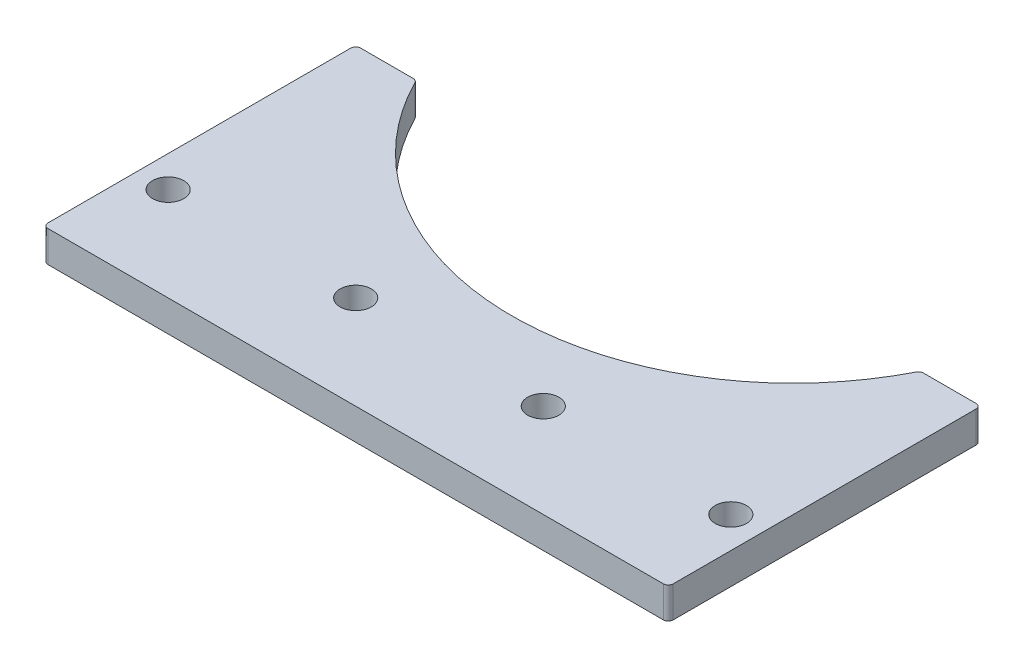
ISO-10303-21;
HEADER;
FILE_DESCRIPTION(('STEP AP214'),'2;1');
FILE_NAME('part.step','',(''),(''),'','','');
FILE_SCHEMA(('AUTOMOTIVE_DESIGN { 1 0 10303 214 1 1 1 1 }'));
ENDSEC;
DATA;
#1=APPLICATION_CONTEXT('core data for automotive mechanical design processes');
#2=APPLICATION_PROTOCOL_DEFINITION('international standard','automotive_design',2000,#1);
#3=PRODUCT_CONTEXT('',#1,'mechanical');
#4=PRODUCT('Part','Part','',(#3));
#5=PRODUCT_RELATED_PRODUCT_CATEGORY('part','',(#4));
#6=PRODUCT_DEFINITION_FORMATION('','',#4);
#7=PRODUCT_DEFINITION_CONTEXT('part definition',#1,'design');
#8=PRODUCT_DEFINITION('design','',#6,#7);
#9=PRODUCT_DEFINITION_SHAPE('','',#8);
#10=(LENGTH_UNIT() NAMED_UNIT(*) SI_UNIT(.MILLI.,.METRE.));
#11=(NAMED_UNIT(*) PLANE_ANGLE_UNIT() SI_UNIT($,.RADIAN.));
#12=(NAMED_UNIT(*) SI_UNIT($,.STERADIAN.) SOLID_ANGLE_UNIT());
#13=UNCERTAINTY_MEASURE_WITH_UNIT(LENGTH_MEASURE(1.E-05),#10,'distance_accuracy_value','');
#14=(GEOMETRIC_REPRESENTATION_CONTEXT(3) GLOBAL_UNCERTAINTY_ASSIGNED_CONTEXT((#13)) GLOBAL_UNIT_ASSIGNED_CONTEXT((#10,
#11,#12)) REPRESENTATION_CONTEXT('',''));
#15=CARTESIAN_POINT('',(0.,0.,0.));
#16=DIRECTION('',(0.,0.,1.));
#17=DIRECTION('',(1.,0.,0.));
#18=AXIS2_PLACEMENT_3D('',#15,#16,#17);
#19=CARTESIAN_POINT('',(-63.5,6.35,88.9));
#20=DIRECTION('',(1.,0.,0.));
#21=DIRECTION('',(0.,0.,-1.));
#22=AXIS2_PLACEMENT_3D('',#19,#20,#21);
#23=PLANE('',#22);
#24=DIRECTION('',(0.,0.,1.));
#25=VECTOR('',#24,1.);
#26=CARTESIAN_POINT('',(-63.5,6.35,88.9));
#27=LINE('',#26,#25);
#28=CARTESIAN_POINT('',(-63.5,6.35,26.4));
#29=VERTEX_POINT('',#28);
#30=CARTESIAN_POINT('',(-63.5,6.35,87.9));
#31=VERTEX_POINT('',#30);
#32=EDGE_CURVE('E148',#29,#31,#27,.T.);
#33=ORIENTED_EDGE('',*,*,#32,.F.);
#34=DIRECTION('',(0.,-1.,0.));
#35=VECTOR('',#34,1.);
#36=CARTESIAN_POINT('',(-63.5,6.35,26.4));
#37=LINE('',#36,#35);
#38=CARTESIAN_POINT('',(-63.5,0.,26.4));
#39=VERTEX_POINT('',#38);
#40=EDGE_CURVE('E183',#29,#39,#37,.T.);
#41=ORIENTED_EDGE('',*,*,#40,.T.);
#42=DIRECTION('',(0.,0.,1.));
#43=VECTOR('',#42,1.);
#44=CARTESIAN_POINT('',(-63.5,0.,88.9));
#45=LINE('',#44,#43);
#46=CARTESIAN_POINT('',(-63.5,0.,87.9));
#47=VERTEX_POINT('',#46);
#48=EDGE_CURVE('E209',#39,#47,#45,.T.);
#49=ORIENTED_EDGE('',*,*,#48,.T.);
#50=DIRECTION('',(0.,-1.,0.));
#51=VECTOR('',#50,1.);
#52=CARTESIAN_POINT('',(-63.5,6.35,87.9));
#53=LINE('',#52,#51);
#54=EDGE_CURVE('E181',#47,#31,#53,.F.);
#55=ORIENTED_EDGE('',*,*,#54,.T.);
#56=EDGE_LOOP('',(#33,#41,#49,#55));
#57=FACE_BOUND('',#56,.T.);
#58=ADVANCED_FACE('F33',(#57),#23,.F.);
#59=CARTESIAN_POINT('',(-63.5,6.35,88.9));
#60=DIRECTION('',(0.,0.,-1.));
#61=DIRECTION('',(-1.,0.,0.));
#62=AXIS2_PLACEMENT_3D('',#59,#60,#61);
#63=PLANE('',#62);
#64=DIRECTION('',(1.,0.,0.));
#65=VECTOR('',#64,1.);
#66=CARTESIAN_POINT('',(-63.5,6.35,88.9));
#67=LINE('',#66,#65);
#68=CARTESIAN_POINT('',(-62.5,6.35,88.9));
#69=VERTEX_POINT('',#68);
#70=CARTESIAN_POINT('',(62.5,6.35,88.9));
#71=VERTEX_POINT('',#70);
#72=EDGE_CURVE('E152',#69,#71,#67,.T.);
#73=ORIENTED_EDGE('',*,*,#72,.F.);
#74=DIRECTION('',(0.,-1.,0.));
#75=VECTOR('',#74,1.);
#76=CARTESIAN_POINT('',(-62.5,6.35,88.9));
#77=LINE('',#76,#75);
#78=CARTESIAN_POINT('',(-62.5,0.,88.9));
#79=VERTEX_POINT('',#78);
#80=EDGE_CURVE('E188',#69,#79,#77,.T.);
#81=ORIENTED_EDGE('',*,*,#80,.T.);
#82=DIRECTION('',(1.,0.,0.));
#83=VECTOR('',#82,1.);
#84=CARTESIAN_POINT('',(-63.5,0.,88.9));
#85=LINE('',#84,#83);
#86=CARTESIAN_POINT('',(62.5,0.,88.9));
#87=VERTEX_POINT('',#86);
#88=EDGE_CURVE('E204',#79,#87,#85,.T.);
#89=ORIENTED_EDGE('',*,*,#88,.T.);
#90=DIRECTION('',(0.,-1.,0.));
#91=VECTOR('',#90,1.);
#92=CARTESIAN_POINT('',(62.5,6.35,88.9));
#93=LINE('',#92,#91);
#94=EDGE_CURVE('E186',#87,#71,#93,.F.);
#95=ORIENTED_EDGE('',*,*,#94,.T.);
#96=EDGE_LOOP('',(#73,#81,#89,#95));
#97=FACE_BOUND('',#96,.T.);
#98=ADVANCED_FACE('F281',(#97),#63,.F.);
#99=CARTESIAN_POINT('',(63.5,6.35,88.9));
#100=DIRECTION('',(-1.,0.,0.));
#101=DIRECTION('',(0.,0.,1.));
#102=AXIS2_PLACEMENT_3D('',#99,#100,#101);
#103=PLANE('',#102);
#104=DIRECTION('',(0.,0.,-1.));
#105=VECTOR('',#104,1.);
#106=CARTESIAN_POINT('',(63.5,6.35,88.9));
#107=LINE('',#106,#105);
#108=CARTESIAN_POINT('',(63.5,6.35,87.9));
#109=VERTEX_POINT('',#108);
#110=CARTESIAN_POINT('',(63.5,6.35,26.4));
#111=VERTEX_POINT('',#110);
#112=EDGE_CURVE('E218',#109,#111,#107,.T.);
#113=ORIENTED_EDGE('',*,*,#112,.F.);
#114=DIRECTION('',(0.,-1.,0.));
#115=VECTOR('',#114,1.);
#116=CARTESIAN_POINT('',(63.5,6.35,87.9));
#117=LINE('',#116,#115);
#118=CARTESIAN_POINT('',(63.5,0.,87.9));
#119=VERTEX_POINT('',#118);
#120=EDGE_CURVE('E193',#109,#119,#117,.T.);
#121=ORIENTED_EDGE('',*,*,#120,.T.);
#122=DIRECTION('',(0.,0.,-1.));
#123=VECTOR('',#122,1.);
#124=CARTESIAN_POINT('',(63.5,0.,88.9));
#125=LINE('',#124,#123);
#126=CARTESIAN_POINT('',(63.5,0.,26.4));
#127=VERTEX_POINT('',#126);
#128=EDGE_CURVE('E203',#119,#127,#125,.T.);
#129=ORIENTED_EDGE('',*,*,#128,.T.);
#130=DIRECTION('',(0.,-1.,0.));
#131=VECTOR('',#130,1.);
#132=CARTESIAN_POINT('',(63.5,6.35,26.4));
#133=LINE('',#132,#131);
#134=EDGE_CURVE('E191',#127,#111,#133,.F.);
#135=ORIENTED_EDGE('',*,*,#134,.T.);
#136=EDGE_LOOP('',(#113,#121,#129,#135));
#137=FACE_BOUND('',#136,.T.);
#138=ADVANCED_FACE('F287',(#137),#103,.F.);
#139=CARTESIAN_POINT('',(51.1953367016958,6.35,25.4));
#140=DIRECTION('',(0.,0.,1.));
#141=DIRECTION('',(1.,0.,0.));
#142=AXIS2_PLACEMENT_3D('',#139,#140,#141);
#143=PLANE('',#142);
#144=DIRECTION('',(-1.,0.,0.));
#145=VECTOR('',#144,1.);
#146=CARTESIAN_POINT('',(51.1953367016958,0.,25.4));
#147=LINE('',#146,#145);
#148=CARTESIAN_POINT('',(62.5,0.,25.4));
#149=VERTEX_POINT('',#148);
#150=CARTESIAN_POINT('',(51.8117988492969,0.,25.4));
#151=VERTEX_POINT('',#150);
#152=EDGE_CURVE('E154',#149,#151,#147,.T.);
#153=ORIENTED_EDGE('',*,*,#152,.T.);
#154=DIRECTION('',(0.,-1.,0.));
#155=VECTOR('',#154,1.);
#156=CARTESIAN_POINT('',(51.8117988492969,6.35,25.4));
#157=LINE('',#156,#155);
#158=CARTESIAN_POINT('',(51.8117988492969,6.35,25.4));
#159=VERTEX_POINT('',#158);
#160=EDGE_CURVE('E11',#151,#159,#157,.F.);
#161=ORIENTED_EDGE('',*,*,#160,.T.);
#162=DIRECTION('',(-1.,0.,0.));
#163=VECTOR('',#162,1.);
#164=CARTESIAN_POINT('',(51.1953367016958,6.35,25.4));
#165=LINE('',#164,#163);
#166=CARTESIAN_POINT('',(62.5,6.35,25.4));
#167=VERTEX_POINT('',#166);
#168=EDGE_CURVE('E199',#167,#159,#165,.T.);
#169=ORIENTED_EDGE('',*,*,#168,.F.);
#170=DIRECTION('',(0.,-1.,0.));
#171=VECTOR('',#170,1.);
#172=CARTESIAN_POINT('',(62.5,6.35,25.4));
#173=LINE('',#172,#171);
#174=EDGE_CURVE('E41',#167,#149,#173,.T.);
#175=ORIENTED_EDGE('',*,*,#174,.T.);
#176=EDGE_LOOP('',(#153,#161,#169,#175));
#177=FACE_BOUND('',#176,.T.);
#178=ADVANCED_FACE('F198',(#177),#143,.F.);
#179=CARTESIAN_POINT('',(0.,6.35,0.));
#180=DIRECTION('',(0.,-1.,0.));
#181=DIRECTION('',(0.,0.,-1.));
#182=AXIS2_PLACEMENT_3D('',#179,#180,#181);
#183=CYLINDRICAL_SURFACE('',#182,57.15);
#184=CARTESIAN_POINT('',(0.,0.,0.));
#185=DIRECTION('',(0.,-1.,0.));
#186=DIRECTION('',(0.,0.,1.));
#187=AXIS2_PLACEMENT_3D('',#184,#185,#186);
#188=CIRCLE('',#187,57.15);
#189=CARTESIAN_POINT('',(50.9207962895497,0.,25.9460017196904));
#190=VERTEX_POINT('',#189);
#191=CARTESIAN_POINT('',(-50.9207962895497,0.,25.9460017196905));
#192=VERTEX_POINT('',#191);
#193=EDGE_CURVE('E149',#190,#192,#188,.T.);
#194=ORIENTED_EDGE('',*,*,#193,.T.);
#195=DIRECTION('',(0.,-1.,0.));
#196=VECTOR('',#195,1.);
#197=CARTESIAN_POINT('',(-50.9207962895497,6.35,25.9460017196905));
#198=LINE('',#197,#196);
#199=CARTESIAN_POINT('',(-50.9207962895497,6.35,25.9460017196905));
#200=VERTEX_POINT('',#199);
#201=EDGE_CURVE('E127',#192,#200,#198,.F.);
#202=ORIENTED_EDGE('',*,*,#201,.T.);
#203=CARTESIAN_POINT('',(0.,6.35,0.));
#204=DIRECTION('',(0.,-1.,0.));
#205=DIRECTION('',(0.,0.,1.));
#206=AXIS2_PLACEMENT_3D('',#203,#204,#205);
#207=CIRCLE('',#206,57.15);
#208=CARTESIAN_POINT('',(50.9207962895497,6.35,25.9460017196904));
#209=VERTEX_POINT('',#208);
#210=EDGE_CURVE('E214',#209,#200,#207,.T.);
#211=ORIENTED_EDGE('',*,*,#210,.F.);
#212=DIRECTION('',(0.,-1.,0.));
#213=VECTOR('',#212,1.);
#214=CARTESIAN_POINT('',(50.9207962895497,6.35,25.9460017196904));
#215=LINE('',#214,#213);
#216=EDGE_CURVE('E132',#209,#190,#215,.T.);
#217=ORIENTED_EDGE('',*,*,#216,.T.);
#218=EDGE_LOOP('',(#194,#202,#211,#217));
#219=FACE_BOUND('',#218,.T.);
#220=ADVANCED_FACE('F268',(#219),#183,.F.);
#221=CARTESIAN_POINT('',(-63.5,6.35,25.4));
#222=DIRECTION('',(0.,0.,1.));
#223=DIRECTION('',(1.,0.,0.));
#224=AXIS2_PLACEMENT_3D('',#221,#222,#223);
#225=PLANE('',#224);
#226=DIRECTION('',(-1.,0.,0.));
#227=VECTOR('',#226,1.);
#228=CARTESIAN_POINT('',(-63.5,6.35,25.4));
#229=LINE('',#228,#227);
#230=CARTESIAN_POINT('',(-51.8117988492969,6.35,25.4));
#231=VERTEX_POINT('',#230);
#232=CARTESIAN_POINT('',(-62.5,6.35,25.4));
#233=VERTEX_POINT('',#232);
#234=EDGE_CURVE('E142',#231,#233,#229,.T.);
#235=ORIENTED_EDGE('',*,*,#234,.F.);
#236=DIRECTION('',(0.,-1.,0.));
#237=VECTOR('',#236,1.);
#238=CARTESIAN_POINT('',(-51.8117988492969,6.35,25.4));
#239=LINE('',#238,#237);
#240=CARTESIAN_POINT('',(-51.8117988492969,0.,25.4));
#241=VERTEX_POINT('',#240);
#242=EDGE_CURVE('E126',#231,#241,#239,.T.);
#243=ORIENTED_EDGE('',*,*,#242,.T.);
#244=DIRECTION('',(-1.,0.,0.));
#245=VECTOR('',#244,1.);
#246=CARTESIAN_POINT('',(-63.5,0.,25.4));
#247=LINE('',#246,#245);
#248=CARTESIAN_POINT('',(-62.5,0.,25.4));
#249=VERTEX_POINT('',#248);
#250=EDGE_CURVE('E139',#241,#249,#247,.T.);
#251=ORIENTED_EDGE('',*,*,#250,.T.);
#252=DIRECTION('',(0.,-1.,0.));
#253=VECTOR('',#252,1.);
#254=CARTESIAN_POINT('',(-62.5,6.35,25.4));
#255=LINE('',#254,#253);
#256=EDGE_CURVE('E144',#249,#233,#255,.F.);
#257=ORIENTED_EDGE('',*,*,#256,.T.);
#258=EDGE_LOOP('',(#235,#243,#251,#257));
#259=FACE_BOUND('',#258,.T.);
#260=ADVANCED_FACE('F138',(#259),#225,.F.);
#261=CARTESIAN_POINT('',(0.,6.35,0.));
#262=DIRECTION('',(0.,1.,0.));
#263=DIRECTION('',(0.,0.,1.));
#264=AXIS2_PLACEMENT_3D('',#261,#262,#263);
#265=PLANE('',#264);
#266=CARTESIAN_POINT('',(-57.15,6.35,69.85));
#267=DIRECTION('',(0.,1.,0.));
#268=DIRECTION('',(0.,0.,-1.));
#269=AXIS2_PLACEMENT_3D('',#266,#267,#268);
#270=CIRCLE('',#269,3.175);
#271=CARTESIAN_POINT('',(-57.15,6.35,66.675));
#272=VERTEX_POINT('',#271);
#273=EDGE_CURVE('E240',#272,#272,#270,.T.);
#274=ORIENTED_EDGE('',*,*,#273,.F.);
#275=EDGE_LOOP('',(#274));
#276=FACE_BOUND('',#275,.T.);
#277=CARTESIAN_POINT('',(57.15,6.35,69.85));
#278=DIRECTION('',(0.,1.,0.));
#279=DIRECTION('',(0.,0.,1.));
#280=AXIS2_PLACEMENT_3D('',#277,#278,#279);
#281=CIRCLE('',#280,3.175);
#282=CARTESIAN_POINT('',(57.15,6.35,73.025));
#283=VERTEX_POINT('',#282);
#284=EDGE_CURVE('E234',#283,#283,#281,.T.);
#285=ORIENTED_EDGE('',*,*,#284,.F.);
#286=EDGE_LOOP('',(#285));
#287=FACE_BOUND('',#286,.T.);
#288=CARTESIAN_POINT('',(19.05,6.35,69.85));
#289=DIRECTION('',(0.,1.,0.));
#290=DIRECTION('',(0.,0.,-1.));
#291=AXIS2_PLACEMENT_3D('',#288,#289,#290);
#292=CIRCLE('',#291,3.175);
#293=CARTESIAN_POINT('',(19.05,6.35,66.675));
#294=VERTEX_POINT('',#293);
#295=EDGE_CURVE('E228',#294,#294,#292,.T.);
#296=ORIENTED_EDGE('',*,*,#295,.F.);
#297=EDGE_LOOP('',(#296));
#298=FACE_BOUND('',#297,.T.);
#299=CARTESIAN_POINT('',(-19.05,6.35,69.85));
#300=DIRECTION('',(0.,1.,0.));
#301=DIRECTION('',(0.,0.,1.));
#302=AXIS2_PLACEMENT_3D('',#299,#300,#301);
#303=CIRCLE('',#302,3.175);
#304=CARTESIAN_POINT('',(-19.05,6.35,73.025));
#305=VERTEX_POINT('',#304);
#306=EDGE_CURVE('E222',#305,#305,#303,.T.);
#307=ORIENTED_EDGE('',*,*,#306,.F.);
#308=EDGE_LOOP('',(#307));
#309=FACE_BOUND('',#308,.T.);
#310=ORIENTED_EDGE('',*,*,#210,.T.);
#311=CARTESIAN_POINT('',(-51.8117988492969,6.35,26.4));
#312=DIRECTION('',(0.,1.,0.));
#313=DIRECTION('',(0.,0.,1.));
#314=AXIS2_PLACEMENT_3D('',#311,#312,#313);
#315=CIRCLE('',#314,1.);
#316=EDGE_CURVE('E179',#200,#231,#315,.T.);
#317=ORIENTED_EDGE('',*,*,#316,.T.);
#318=ORIENTED_EDGE('',*,*,#234,.T.);
#319=CARTESIAN_POINT('',(-62.5,6.35,26.4));
#320=DIRECTION('',(0.,1.,0.));
#321=DIRECTION('',(0.,0.,1.));
#322=AXIS2_PLACEMENT_3D('',#319,#320,#321);
#323=CIRCLE('',#322,1.);
#324=EDGE_CURVE('E177',#233,#29,#323,.T.);
#325=ORIENTED_EDGE('',*,*,#324,.T.);
#326=ORIENTED_EDGE('',*,*,#32,.T.);
#327=CARTESIAN_POINT('',(-62.5,6.35,87.9));
#328=DIRECTION('',(0.,1.,0.));
#329=DIRECTION('',(0.,0.,1.));
#330=AXIS2_PLACEMENT_3D('',#327,#328,#329);
#331=CIRCLE('',#330,1.);
#332=EDGE_CURVE('E175',#31,#69,#331,.T.);
#333=ORIENTED_EDGE('',*,*,#332,.T.);
#334=ORIENTED_EDGE('',*,*,#72,.T.);
#335=CARTESIAN_POINT('',(62.5,6.35,87.9));
#336=DIRECTION('',(0.,1.,0.));
#337=DIRECTION('',(0.,0.,1.));
#338=AXIS2_PLACEMENT_3D('',#335,#336,#337);
#339=CIRCLE('',#338,1.);
#340=EDGE_CURVE('E173',#71,#109,#339,.T.);
#341=ORIENTED_EDGE('',*,*,#340,.T.);
#342=ORIENTED_EDGE('',*,*,#112,.T.);
#343=CARTESIAN_POINT('',(62.5,6.35,26.4));
#344=DIRECTION('',(0.,1.,0.));
#345=DIRECTION('',(0.,0.,1.));
#346=AXIS2_PLACEMENT_3D('',#343,#344,#345);
#347=CIRCLE('',#346,1.);
#348=EDGE_CURVE('E53',#111,#167,#347,.T.);
#349=ORIENTED_EDGE('',*,*,#348,.T.);
#350=ORIENTED_EDGE('',*,*,#168,.T.);
#351=CARTESIAN_POINT('',(51.8117988492969,6.35,26.4));
#352=DIRECTION('',(0.,1.,0.));
#353=DIRECTION('',(0.,0.,1.));
#354=AXIS2_PLACEMENT_3D('',#351,#352,#353);
#355=CIRCLE('',#354,1.);
#356=EDGE_CURVE('E171',#159,#209,#355,.T.);
#357=ORIENTED_EDGE('',*,*,#356,.T.);
#358=EDGE_LOOP('',(#310,#317,#318,#325,#326,#333,#334,#341,#342,#349,#350,#357));
#359=FACE_BOUND('',#358,.T.);
#360=ADVANCED_FACE('F255',(#276,#287,#298,#309,#359),#265,.T.);
#361=CARTESIAN_POINT('',(0.,0.,0.));
#362=DIRECTION('',(0.,1.,0.));
#363=DIRECTION('',(0.,0.,1.));
#364=AXIS2_PLACEMENT_3D('',#361,#362,#363);
#365=PLANE('',#364);
#366=CARTESIAN_POINT('',(-57.15,0.,69.85));
#367=DIRECTION('',(0.,1.,0.));
#368=DIRECTION('',(0.,0.,-1.));
#369=AXIS2_PLACEMENT_3D('',#366,#367,#368);
#370=CIRCLE('',#369,3.175);
#371=CARTESIAN_POINT('',(-57.15,0.,66.675));
#372=VERTEX_POINT('',#371);
#373=EDGE_CURVE('E237',#372,#372,#370,.T.);
#374=ORIENTED_EDGE('',*,*,#373,.T.);
#375=EDGE_LOOP('',(#374));
#376=FACE_BOUND('',#375,.T.);
#377=CARTESIAN_POINT('',(57.15,0.,69.85));
#378=DIRECTION('',(0.,1.,0.));
#379=DIRECTION('',(0.,0.,1.));
#380=AXIS2_PLACEMENT_3D('',#377,#378,#379);
#381=CIRCLE('',#380,3.175);
#382=CARTESIAN_POINT('',(57.15,0.,73.025));
#383=VERTEX_POINT('',#382);
#384=EDGE_CURVE('E231',#383,#383,#381,.T.);
#385=ORIENTED_EDGE('',*,*,#384,.T.);
#386=EDGE_LOOP('',(#385));
#387=FACE_BOUND('',#386,.T.);
#388=CARTESIAN_POINT('',(19.05,0.,69.85));
#389=DIRECTION('',(0.,1.,0.));
#390=DIRECTION('',(0.,0.,-1.));
#391=AXIS2_PLACEMENT_3D('',#388,#389,#390);
#392=CIRCLE('',#391,3.175);
#393=CARTESIAN_POINT('',(19.05,0.,66.675));
#394=VERTEX_POINT('',#393);
#395=EDGE_CURVE('E225',#394,#394,#392,.T.);
#396=ORIENTED_EDGE('',*,*,#395,.T.);
#397=EDGE_LOOP('',(#396));
#398=FACE_BOUND('',#397,.T.);
#399=CARTESIAN_POINT('',(-19.05,0.,69.85));
#400=DIRECTION('',(0.,1.,0.));
#401=DIRECTION('',(0.,0.,1.));
#402=AXIS2_PLACEMENT_3D('',#399,#400,#401);
#403=CIRCLE('',#402,3.175);
#404=CARTESIAN_POINT('',(-19.05,0.,73.025));
#405=VERTEX_POINT('',#404);
#406=EDGE_CURVE('E212',#405,#405,#403,.T.);
#407=ORIENTED_EDGE('',*,*,#406,.T.);
#408=EDGE_LOOP('',(#407));
#409=FACE_BOUND('',#408,.T.);
#410=ORIENTED_EDGE('',*,*,#250,.F.);
#411=CARTESIAN_POINT('',(-51.8117988492969,0.,26.4));
#412=DIRECTION('',(0.,1.,0.));
#413=DIRECTION('',(0.,0.,1.));
#414=AXIS2_PLACEMENT_3D('',#411,#412,#413);
#415=CIRCLE('',#414,1.);
#416=EDGE_CURVE('E122',#241,#192,#415,.F.);
#417=ORIENTED_EDGE('',*,*,#416,.T.);
#418=ORIENTED_EDGE('',*,*,#193,.F.);
#419=CARTESIAN_POINT('',(51.8117988492969,0.,26.4));
#420=DIRECTION('',(0.,1.,0.));
#421=DIRECTION('',(0.,0.,1.));
#422=AXIS2_PLACEMENT_3D('',#419,#420,#421);
#423=CIRCLE('',#422,1.);
#424=EDGE_CURVE('E160',#190,#151,#423,.F.);
#425=ORIENTED_EDGE('',*,*,#424,.T.);
#426=ORIENTED_EDGE('',*,*,#152,.F.);
#427=CARTESIAN_POINT('',(62.5,0.,26.4));
#428=DIRECTION('',(0.,1.,0.));
#429=DIRECTION('',(0.,0.,1.));
#430=AXIS2_PLACEMENT_3D('',#427,#428,#429);
#431=CIRCLE('',#430,1.);
#432=EDGE_CURVE('E143',#149,#127,#431,.F.);
#433=ORIENTED_EDGE('',*,*,#432,.T.);
#434=ORIENTED_EDGE('',*,*,#128,.F.);
#435=CARTESIAN_POINT('',(62.5,0.,87.9));
#436=DIRECTION('',(0.,1.,0.));
#437=DIRECTION('',(0.,0.,1.));
#438=AXIS2_PLACEMENT_3D('',#435,#436,#437);
#439=CIRCLE('',#438,1.);
#440=EDGE_CURVE('E162',#119,#87,#439,.F.);
#441=ORIENTED_EDGE('',*,*,#440,.T.);
#442=ORIENTED_EDGE('',*,*,#88,.F.);
#443=CARTESIAN_POINT('',(-62.5,0.,87.9));
#444=DIRECTION('',(0.,1.,0.));
#445=DIRECTION('',(0.,0.,1.));
#446=AXIS2_PLACEMENT_3D('',#443,#444,#445);
#447=CIRCLE('',#446,1.);
#448=EDGE_CURVE('E164',#79,#47,#447,.F.);
#449=ORIENTED_EDGE('',*,*,#448,.T.);
#450=ORIENTED_EDGE('',*,*,#48,.F.);
#451=CARTESIAN_POINT('',(-62.5,0.,26.4));
#452=DIRECTION('',(0.,1.,0.));
#453=DIRECTION('',(0.,0.,1.));
#454=AXIS2_PLACEMENT_3D('',#451,#452,#453);
#455=CIRCLE('',#454,1.);
#456=EDGE_CURVE('E133',#39,#249,#455,.F.);
#457=ORIENTED_EDGE('',*,*,#456,.T.);
#458=EDGE_LOOP('',(#410,#417,#418,#425,#426,#433,#434,#441,#442,#449,#450,#457));
#459=FACE_BOUND('',#458,.T.);
#460=ADVANCED_FACE('F146',(#376,#387,#398,#409,#459),#365,.F.);
#461=CARTESIAN_POINT('',(-19.05,0.,69.85));
#462=DIRECTION('',(0.,1.,0.));
#463=DIRECTION('',(0.,0.,1.));
#464=AXIS2_PLACEMENT_3D('',#461,#462,#463);
#465=CYLINDRICAL_SURFACE('',#464,3.175);
#466=ORIENTED_EDGE('',*,*,#406,.F.);
#467=EDGE_LOOP('',(#466));
#468=FACE_BOUND('',#467,.T.);
#469=ORIENTED_EDGE('',*,*,#306,.T.);
#470=EDGE_LOOP('',(#469));
#471=FACE_BOUND('',#470,.T.);
#472=ADVANCED_FACE('F327',(#468,#471),#465,.F.);
#473=CARTESIAN_POINT('',(19.05,0.,69.85));
#474=DIRECTION('',(0.,1.,0.));
#475=DIRECTION('',(0.,0.,1.));
#476=AXIS2_PLACEMENT_3D('',#473,#474,#475);
#477=CYLINDRICAL_SURFACE('',#476,3.175);
#478=ORIENTED_EDGE('',*,*,#395,.F.);
#479=EDGE_LOOP('',(#478));
#480=FACE_BOUND('',#479,.T.);
#481=ORIENTED_EDGE('',*,*,#295,.T.);
#482=EDGE_LOOP('',(#481));
#483=FACE_BOUND('',#482,.T.);
#484=ADVANCED_FACE('F331',(#480,#483),#477,.F.);
#485=CARTESIAN_POINT('',(57.15,0.,69.85));
#486=DIRECTION('',(0.,1.,0.));
#487=DIRECTION('',(0.,0.,1.));
#488=AXIS2_PLACEMENT_3D('',#485,#486,#487);
#489=CYLINDRICAL_SURFACE('',#488,3.175);
#490=ORIENTED_EDGE('',*,*,#384,.F.);
#491=EDGE_LOOP('',(#490));
#492=FACE_BOUND('',#491,.T.);
#493=ORIENTED_EDGE('',*,*,#284,.T.);
#494=EDGE_LOOP('',(#493));
#495=FACE_BOUND('',#494,.T.);
#496=ADVANCED_FACE('F251',(#492,#495),#489,.F.);
#497=CARTESIAN_POINT('',(-57.15,0.,69.85));
#498=DIRECTION('',(0.,1.,0.));
#499=DIRECTION('',(0.,0.,1.));
#500=AXIS2_PLACEMENT_3D('',#497,#498,#499);
#501=CYLINDRICAL_SURFACE('',#500,3.175);
#502=ORIENTED_EDGE('',*,*,#373,.F.);
#503=EDGE_LOOP('',(#502));
#504=FACE_BOUND('',#503,.T.);
#505=ORIENTED_EDGE('',*,*,#273,.T.);
#506=EDGE_LOOP('',(#505));
#507=FACE_BOUND('',#506,.T.);
#508=ADVANCED_FACE('F248',(#504,#507),#501,.F.);
#509=CARTESIAN_POINT('',(-51.8117988492969,6.35,26.4));
#510=DIRECTION('',(0.,-1.,0.));
#511=DIRECTION('',(0.,0.,-1.));
#512=AXIS2_PLACEMENT_3D('',#509,#510,#511);
#513=CYLINDRICAL_SURFACE('',#512,1.);
#514=ORIENTED_EDGE('',*,*,#316,.F.);
#515=ORIENTED_EDGE('',*,*,#201,.F.);
#516=ORIENTED_EDGE('',*,*,#416,.F.);
#517=ORIENTED_EDGE('',*,*,#242,.F.);
#518=EDGE_LOOP('',(#514,#515,#516,#517));
#519=FACE_BOUND('',#518,.T.);
#520=ADVANCED_FACE('F125',(#519),#513,.T.);
#521=CARTESIAN_POINT('',(-62.5,6.35,26.4));
#522=DIRECTION('',(0.,-1.,0.));
#523=DIRECTION('',(0.,0.,-1.));
#524=AXIS2_PLACEMENT_3D('',#521,#522,#523);
#525=CYLINDRICAL_SURFACE('',#524,1.);
#526=ORIENTED_EDGE('',*,*,#324,.F.);
#527=ORIENTED_EDGE('',*,*,#256,.F.);
#528=ORIENTED_EDGE('',*,*,#456,.F.);
#529=ORIENTED_EDGE('',*,*,#40,.F.);
#530=EDGE_LOOP('',(#526,#527,#528,#529));
#531=FACE_BOUND('',#530,.T.);
#532=ADVANCED_FACE('F295',(#531),#525,.T.);
#533=CARTESIAN_POINT('',(-62.5,6.35,87.9));
#534=DIRECTION('',(0.,-1.,0.));
#535=DIRECTION('',(0.,0.,-1.));
#536=AXIS2_PLACEMENT_3D('',#533,#534,#535);
#537=CYLINDRICAL_SURFACE('',#536,1.);
#538=ORIENTED_EDGE('',*,*,#332,.F.);
#539=ORIENTED_EDGE('',*,*,#54,.F.);
#540=ORIENTED_EDGE('',*,*,#448,.F.);
#541=ORIENTED_EDGE('',*,*,#80,.F.);
#542=EDGE_LOOP('',(#538,#539,#540,#541));
#543=FACE_BOUND('',#542,.T.);
#544=ADVANCED_FACE('F277',(#543),#537,.T.);
#545=CARTESIAN_POINT('',(62.5,6.35,87.9));
#546=DIRECTION('',(0.,-1.,0.));
#547=DIRECTION('',(0.,0.,-1.));
#548=AXIS2_PLACEMENT_3D('',#545,#546,#547);
#549=CYLINDRICAL_SURFACE('',#548,1.);
#550=ORIENTED_EDGE('',*,*,#340,.F.);
#551=ORIENTED_EDGE('',*,*,#94,.F.);
#552=ORIENTED_EDGE('',*,*,#440,.F.);
#553=ORIENTED_EDGE('',*,*,#120,.F.);
#554=EDGE_LOOP('',(#550,#551,#552,#553));
#555=FACE_BOUND('',#554,.T.);
#556=ADVANCED_FACE('F272',(#555),#549,.T.);
#557=CARTESIAN_POINT('',(51.8117988492969,6.35,26.4));
#558=DIRECTION('',(0.,-1.,0.));
#559=DIRECTION('',(0.,0.,-1.));
#560=AXIS2_PLACEMENT_3D('',#557,#558,#559);
#561=CYLINDRICAL_SURFACE('',#560,1.);
#562=ORIENTED_EDGE('',*,*,#356,.F.);
#563=ORIENTED_EDGE('',*,*,#160,.F.);
#564=ORIENTED_EDGE('',*,*,#424,.F.);
#565=ORIENTED_EDGE('',*,*,#216,.F.);
#566=EDGE_LOOP('',(#562,#563,#564,#565));
#567=FACE_BOUND('',#566,.T.);
#568=ADVANCED_FACE('F270',(#567),#561,.T.);
#569=CARTESIAN_POINT('',(62.5,6.35,26.4));
#570=DIRECTION('',(0.,-1.,0.));
#571=DIRECTION('',(0.,0.,-1.));
#572=AXIS2_PLACEMENT_3D('',#569,#570,#571);
#573=CYLINDRICAL_SURFACE('',#572,1.);
#574=ORIENTED_EDGE('',*,*,#348,.F.);
#575=ORIENTED_EDGE('',*,*,#134,.F.);
#576=ORIENTED_EDGE('',*,*,#432,.F.);
#577=ORIENTED_EDGE('',*,*,#174,.F.);
#578=EDGE_LOOP('',(#574,#575,#576,#577));
#579=FACE_BOUND('',#578,.T.);
#580=ADVANCED_FACE('F35',(#579),#573,.T.);
#581=CLOSED_SHELL('',(#58,#98,#138,#178,#220,#260,#360,#460,#472,#484,#496,#508,#520,#532,#544,
#556,#568,#580));
#582=MANIFOLD_SOLID_BREP('B2',#581);
#583=ADVANCED_BREP_SHAPE_REPRESENTATION('',(#18,#582),#14);
#584=SHAPE_DEFINITION_REPRESENTATION(#9,#583);
ENDSEC;
END-ISO-10303-21;
